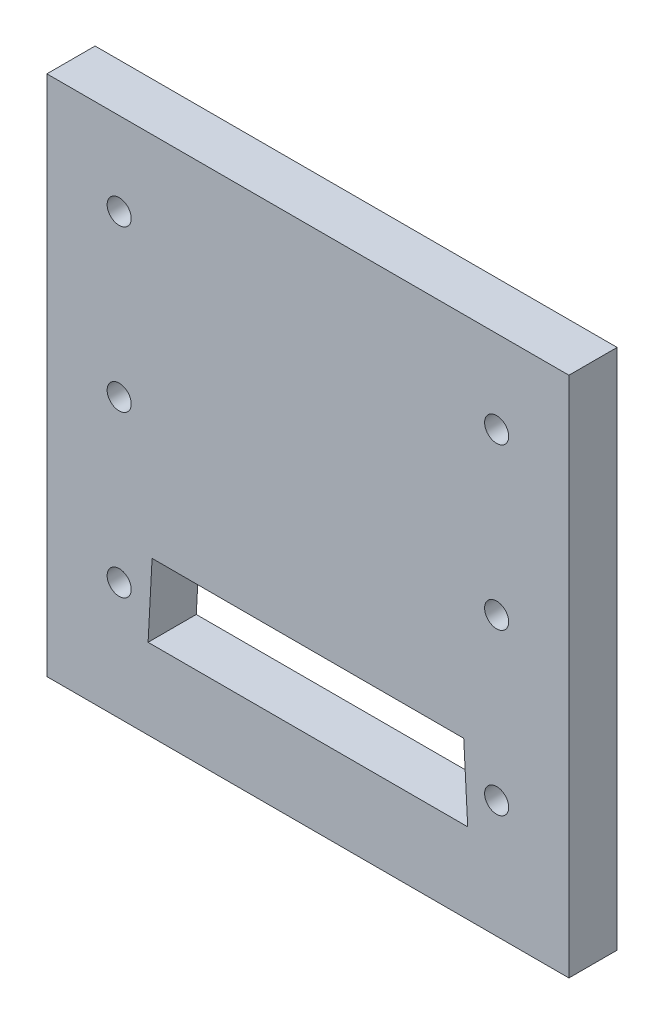
ISO-10303-21;
HEADER;
FILE_DESCRIPTION(('STEP AP214'),'2;1');
FILE_NAME('part.step','',(''),(''),'','','');
FILE_SCHEMA(('AUTOMOTIVE_DESIGN { 1 0 10303 214 1 1 1 1 }'));
ENDSEC;
DATA;
#1=APPLICATION_CONTEXT('core data for automotive mechanical design processes');
#2=APPLICATION_PROTOCOL_DEFINITION('international standard','automotive_design',2000,#1);
#3=PRODUCT_CONTEXT('',#1,'mechanical');
#4=PRODUCT('Part','Part','',(#3));
#5=PRODUCT_RELATED_PRODUCT_CATEGORY('part','',(#4));
#6=PRODUCT_DEFINITION_FORMATION('','',#4);
#7=PRODUCT_DEFINITION_CONTEXT('part definition',#1,'design');
#8=PRODUCT_DEFINITION('design','',#6,#7);
#9=PRODUCT_DEFINITION_SHAPE('','',#8);
#10=(LENGTH_UNIT() NAMED_UNIT(*) SI_UNIT(.MILLI.,.METRE.));
#11=(NAMED_UNIT(*) PLANE_ANGLE_UNIT() SI_UNIT($,.RADIAN.));
#12=(NAMED_UNIT(*) SI_UNIT($,.STERADIAN.) SOLID_ANGLE_UNIT());
#13=UNCERTAINTY_MEASURE_WITH_UNIT(LENGTH_MEASURE(1.E-05),#10,'distance_accuracy_value','');
#14=(GEOMETRIC_REPRESENTATION_CONTEXT(3) GLOBAL_UNCERTAINTY_ASSIGNED_CONTEXT((#13)) GLOBAL_UNIT_ASSIGNED_CONTEXT((#10,
#11,#12)) REPRESENTATION_CONTEXT('',''));
#15=CARTESIAN_POINT('',(0.,0.,0.));
#16=DIRECTION('',(0.,0.,1.));
#17=DIRECTION('',(1.,0.,0.));
#18=AXIS2_PLACEMENT_3D('',#15,#16,#17);
#19=CARTESIAN_POINT('',(0.,0.,6.));
#20=DIRECTION('',(0.,0.,1.));
#21=DIRECTION('',(1.,0.,0.));
#22=AXIS2_PLACEMENT_3D('',#19,#20,#21);
#23=PLANE('',#22);
#24=CARTESIAN_POINT('',(-3.60000000000014,44.65,6.));
#25=DIRECTION('',(0.,0.,1.));
#26=DIRECTION('',(1.,0.,0.));
#27=AXIS2_PLACEMENT_3D('',#24,#25,#26);
#28=CIRCLE('',#27,1.5);
#29=CARTESIAN_POINT('',(-2.10000000000014,44.65,6.));
#30=VERTEX_POINT('',#29);
#31=EDGE_CURVE('E253',#30,#30,#28,.T.);
#32=ORIENTED_EDGE('',*,*,#31,.F.);
#33=EDGE_LOOP('',(#32));
#34=FACE_BOUND('',#33,.T.);
#35=CARTESIAN_POINT('',(-3.60000000000007,24.65,6.));
#36=DIRECTION('',(0.,0.,1.));
#37=DIRECTION('',(1.,0.,0.));
#38=AXIS2_PLACEMENT_3D('',#35,#36,#37);
#39=CIRCLE('',#38,1.5);
#40=CARTESIAN_POINT('',(-2.10000000000007,24.65,6.));
#41=VERTEX_POINT('',#40);
#42=EDGE_CURVE('E265',#41,#41,#39,.T.);
#43=ORIENTED_EDGE('',*,*,#42,.F.);
#44=EDGE_LOOP('',(#43));
#45=FACE_BOUND('',#44,.T.);
#46=CARTESIAN_POINT('',(-3.6,4.65,6.));
#47=DIRECTION('',(0.,0.,1.));
#48=DIRECTION('',(1.,0.,0.));
#49=AXIS2_PLACEMENT_3D('',#46,#47,#48);
#50=CIRCLE('',#49,1.5);
#51=CARTESIAN_POINT('',(-2.1,4.65,6.));
#52=VERTEX_POINT('',#51);
#53=EDGE_CURVE('E127',#52,#52,#50,.T.);
#54=ORIENTED_EDGE('',*,*,#53,.F.);
#55=EDGE_LOOP('',(#54));
#56=FACE_BOUND('',#55,.T.);
#57=DIRECTION('',(0.,-1.,0.));
#58=VECTOR('',#57,1.);
#59=CARTESIAN_POINT('',(-12.6,55.,6.));
#60=LINE('',#59,#58);
#61=CARTESIAN_POINT('',(-12.6,55.,6.));
#62=VERTEX_POINT('',#61);
#63=CARTESIAN_POINT('',(-12.6,-10.,6.));
#64=VERTEX_POINT('',#63);
#65=EDGE_CURVE('E137',#62,#64,#60,.T.);
#66=ORIENTED_EDGE('',*,*,#65,.T.);
#67=DIRECTION('',(1.,0.,0.));
#68=VECTOR('',#67,1.);
#69=CARTESIAN_POINT('',(-12.6,-10.,6.));
#70=LINE('',#69,#68);
#71=CARTESIAN_POINT('',(52.4,-10.,6.));
#72=VERTEX_POINT('',#71);
#73=EDGE_CURVE('E140',#64,#72,#70,.T.);
#74=ORIENTED_EDGE('',*,*,#73,.T.);
#75=DIRECTION('',(0.,1.,0.));
#76=VECTOR('',#75,1.);
#77=CARTESIAN_POINT('',(52.4,55.,6.));
#78=LINE('',#77,#76);
#79=CARTESIAN_POINT('',(52.4,55.,6.));
#80=VERTEX_POINT('',#79);
#81=EDGE_CURVE('E143',#72,#80,#78,.T.);
#82=ORIENTED_EDGE('',*,*,#81,.T.);
#83=DIRECTION('',(-1.,0.,0.));
#84=VECTOR('',#83,1.);
#85=CARTESIAN_POINT('',(-12.6,55.,6.));
#86=LINE('',#85,#84);
#87=EDGE_CURVE('E145',#80,#62,#86,.T.);
#88=ORIENTED_EDGE('',*,*,#87,.T.);
#89=EDGE_LOOP('',(#66,#74,#82,#88));
#90=FACE_BOUND('',#89,.T.);
#91=DIRECTION('',(1.,0.,0.));
#92=VECTOR('',#91,1.);
#93=CARTESIAN_POINT('',(0.,0.,6.));
#94=LINE('',#93,#92);
#95=CARTESIAN_POINT('',(0.,0.,6.));
#96=VERTEX_POINT('',#95);
#97=CARTESIAN_POINT('',(39.8,0.,6.));
#98=VERTEX_POINT('',#97);
#99=EDGE_CURVE('E106',#96,#98,#94,.T.);
#100=ORIENTED_EDGE('',*,*,#99,.F.);
#101=DIRECTION('',(-0.053685907087273,-0.998557871823269,0.));
#102=VECTOR('',#101,1.);
#103=CARTESIAN_POINT('',(0.,0.,6.));
#104=LINE('',#103,#102);
#105=CARTESIAN_POINT('',(0.500000000000004,9.3,6.));
#106=VERTEX_POINT('',#105);
#107=EDGE_CURVE('E98',#106,#96,#104,.T.);
#108=ORIENTED_EDGE('',*,*,#107,.F.);
#109=DIRECTION('',(-1.,0.,0.));
#110=VECTOR('',#109,1.);
#111=CARTESIAN_POINT('',(0.500000000000004,9.3,6.));
#112=LINE('',#111,#110);
#113=CARTESIAN_POINT('',(39.3,9.30000000000001,6.));
#114=VERTEX_POINT('',#113);
#115=EDGE_CURVE('E121',#114,#106,#112,.T.);
#116=ORIENTED_EDGE('',*,*,#115,.F.);
#117=DIRECTION('',(-0.0536859070872725,0.998557871823269,0.));
#118=VECTOR('',#117,1.);
#119=CARTESIAN_POINT('',(39.8,0.,6.));
#120=LINE('',#119,#118);
#121=EDGE_CURVE('E119',#98,#114,#120,.T.);
#122=ORIENTED_EDGE('',*,*,#121,.F.);
#123=EDGE_LOOP('',(#100,#108,#116,#122));
#124=FACE_BOUND('',#123,.T.);
#125=CARTESIAN_POINT('',(43.4,4.65,6.));
#126=DIRECTION('',(0.,0.,1.));
#127=DIRECTION('',(1.,0.,0.));
#128=AXIS2_PLACEMENT_3D('',#125,#126,#127);
#129=CIRCLE('',#128,1.5);
#130=CARTESIAN_POINT('',(44.9,4.65,6.));
#131=VERTEX_POINT('',#130);
#132=EDGE_CURVE('E271',#131,#131,#129,.T.);
#133=ORIENTED_EDGE('',*,*,#132,.F.);
#134=EDGE_LOOP('',(#133));
#135=FACE_BOUND('',#134,.T.);
#136=CARTESIAN_POINT('',(43.3999999999999,24.65,6.));
#137=DIRECTION('',(0.,0.,1.));
#138=DIRECTION('',(1.,0.,0.));
#139=AXIS2_PLACEMENT_3D('',#136,#137,#138);
#140=CIRCLE('',#139,1.5);
#141=CARTESIAN_POINT('',(44.8999999999999,24.65,6.));
#142=VERTEX_POINT('',#141);
#143=EDGE_CURVE('E259',#142,#142,#140,.T.);
#144=ORIENTED_EDGE('',*,*,#143,.F.);
#145=EDGE_LOOP('',(#144));
#146=FACE_BOUND('',#145,.T.);
#147=CARTESIAN_POINT('',(43.3999999999999,44.65,6.));
#148=DIRECTION('',(0.,0.,1.));
#149=DIRECTION('',(1.,0.,0.));
#150=AXIS2_PLACEMENT_3D('',#147,#148,#149);
#151=CIRCLE('',#150,1.5);
#152=CARTESIAN_POINT('',(44.8999999999999,44.65,6.));
#153=VERTEX_POINT('',#152);
#154=EDGE_CURVE('E244',#153,#153,#151,.T.);
#155=ORIENTED_EDGE('',*,*,#154,.F.);
#156=EDGE_LOOP('',(#155));
#157=FACE_BOUND('',#156,.T.);
#158=ADVANCED_FACE('F33',(#34,#45,#56,#90,#124,#135,#146,#157),#23,.T.);
#159=CARTESIAN_POINT('',(0.,0.,0.));
#160=DIRECTION('',(0.,0.,1.));
#161=DIRECTION('',(1.,0.,0.));
#162=AXIS2_PLACEMENT_3D('',#159,#160,#161);
#163=PLANE('',#162);
#164=DIRECTION('',(0.,-1.,0.));
#165=VECTOR('',#164,1.);
#166=CARTESIAN_POINT('',(-12.6,55.,0.));
#167=LINE('',#166,#165);
#168=CARTESIAN_POINT('',(-12.6,55.,0.));
#169=VERTEX_POINT('',#168);
#170=CARTESIAN_POINT('',(-12.6,-10.,0.));
#171=VERTEX_POINT('',#170);
#172=EDGE_CURVE('E114',#169,#171,#167,.T.);
#173=ORIENTED_EDGE('',*,*,#172,.F.);
#174=DIRECTION('',(-1.,0.,0.));
#175=VECTOR('',#174,1.);
#176=CARTESIAN_POINT('',(-12.6,55.,0.));
#177=LINE('',#176,#175);
#178=CARTESIAN_POINT('',(52.4,55.,0.));
#179=VERTEX_POINT('',#178);
#180=EDGE_CURVE('E141',#179,#169,#177,.T.);
#181=ORIENTED_EDGE('',*,*,#180,.F.);
#182=DIRECTION('',(0.,1.,0.));
#183=VECTOR('',#182,1.);
#184=CARTESIAN_POINT('',(52.4,55.,0.));
#185=LINE('',#184,#183);
#186=CARTESIAN_POINT('',(52.4,-10.,0.));
#187=VERTEX_POINT('',#186);
#188=EDGE_CURVE('E152',#187,#179,#185,.T.);
#189=ORIENTED_EDGE('',*,*,#188,.F.);
#190=DIRECTION('',(1.,0.,0.));
#191=VECTOR('',#190,1.);
#192=CARTESIAN_POINT('',(-12.6,-10.,0.));
#193=LINE('',#192,#191);
#194=EDGE_CURVE('E150',#171,#187,#193,.T.);
#195=ORIENTED_EDGE('',*,*,#194,.F.);
#196=EDGE_LOOP('',(#173,#181,#189,#195));
#197=FACE_BOUND('',#196,.T.);
#198=DIRECTION('',(-0.053685907087273,-0.998557871823269,0.));
#199=VECTOR('',#198,1.);
#200=CARTESIAN_POINT('',(0.,0.,0.));
#201=LINE('',#200,#199);
#202=CARTESIAN_POINT('',(0.500000000000004,9.3,0.));
#203=VERTEX_POINT('',#202);
#204=CARTESIAN_POINT('',(0.,0.,0.));
#205=VERTEX_POINT('',#204);
#206=EDGE_CURVE('E56',#203,#205,#201,.T.);
#207=ORIENTED_EDGE('',*,*,#206,.T.);
#208=DIRECTION('',(1.,0.,0.));
#209=VECTOR('',#208,1.);
#210=CARTESIAN_POINT('',(0.,0.,0.));
#211=LINE('',#210,#209);
#212=CARTESIAN_POINT('',(39.8,0.,0.));
#213=VERTEX_POINT('',#212);
#214=EDGE_CURVE('E113',#205,#213,#211,.T.);
#215=ORIENTED_EDGE('',*,*,#214,.T.);
#216=DIRECTION('',(-0.0536859070872725,0.998557871823269,0.));
#217=VECTOR('',#216,1.);
#218=CARTESIAN_POINT('',(39.8,0.,0.));
#219=LINE('',#218,#217);
#220=CARTESIAN_POINT('',(39.3,9.30000000000001,0.));
#221=VERTEX_POINT('',#220);
#222=EDGE_CURVE('E129',#213,#221,#219,.T.);
#223=ORIENTED_EDGE('',*,*,#222,.T.);
#224=DIRECTION('',(-1.,0.,0.));
#225=VECTOR('',#224,1.);
#226=CARTESIAN_POINT('',(0.500000000000004,9.3,0.));
#227=LINE('',#226,#225);
#228=EDGE_CURVE('E107',#221,#203,#227,.T.);
#229=ORIENTED_EDGE('',*,*,#228,.T.);
#230=EDGE_LOOP('',(#207,#215,#223,#229));
#231=FACE_BOUND('',#230,.T.);
#232=CARTESIAN_POINT('',(-3.6,4.65,0.));
#233=DIRECTION('',(0.,0.,1.));
#234=DIRECTION('',(1.,0.,0.));
#235=AXIS2_PLACEMENT_3D('',#232,#233,#234);
#236=CIRCLE('',#235,1.5);
#237=CARTESIAN_POINT('',(-2.1,4.65,0.));
#238=VERTEX_POINT('',#237);
#239=EDGE_CURVE('E274',#238,#238,#236,.T.);
#240=ORIENTED_EDGE('',*,*,#239,.T.);
#241=EDGE_LOOP('',(#240));
#242=FACE_BOUND('',#241,.T.);
#243=CARTESIAN_POINT('',(43.4,4.65,0.));
#244=DIRECTION('',(0.,0.,1.));
#245=DIRECTION('',(1.,0.,0.));
#246=AXIS2_PLACEMENT_3D('',#243,#244,#245);
#247=CIRCLE('',#246,1.5);
#248=CARTESIAN_POINT('',(44.9,4.65,0.));
#249=VERTEX_POINT('',#248);
#250=EDGE_CURVE('E268',#249,#249,#247,.T.);
#251=ORIENTED_EDGE('',*,*,#250,.T.);
#252=EDGE_LOOP('',(#251));
#253=FACE_BOUND('',#252,.T.);
#254=CARTESIAN_POINT('',(-3.60000000000007,24.65,0.));
#255=DIRECTION('',(0.,0.,1.));
#256=DIRECTION('',(1.,0.,0.));
#257=AXIS2_PLACEMENT_3D('',#254,#255,#256);
#258=CIRCLE('',#257,1.5);
#259=CARTESIAN_POINT('',(-2.10000000000007,24.65,0.));
#260=VERTEX_POINT('',#259);
#261=EDGE_CURVE('E262',#260,#260,#258,.T.);
#262=ORIENTED_EDGE('',*,*,#261,.T.);
#263=EDGE_LOOP('',(#262));
#264=FACE_BOUND('',#263,.T.);
#265=CARTESIAN_POINT('',(43.3999999999999,24.65,0.));
#266=DIRECTION('',(0.,0.,1.));
#267=DIRECTION('',(1.,0.,0.));
#268=AXIS2_PLACEMENT_3D('',#265,#266,#267);
#269=CIRCLE('',#268,1.5);
#270=CARTESIAN_POINT('',(44.8999999999999,24.65,0.));
#271=VERTEX_POINT('',#270);
#272=EDGE_CURVE('E256',#271,#271,#269,.T.);
#273=ORIENTED_EDGE('',*,*,#272,.T.);
#274=EDGE_LOOP('',(#273));
#275=FACE_BOUND('',#274,.T.);
#276=CARTESIAN_POINT('',(-3.60000000000014,44.65,0.));
#277=DIRECTION('',(0.,0.,1.));
#278=DIRECTION('',(1.,0.,0.));
#279=AXIS2_PLACEMENT_3D('',#276,#277,#278);
#280=CIRCLE('',#279,1.5);
#281=CARTESIAN_POINT('',(-2.10000000000014,44.65,0.));
#282=VERTEX_POINT('',#281);
#283=EDGE_CURVE('E250',#282,#282,#280,.T.);
#284=ORIENTED_EDGE('',*,*,#283,.T.);
#285=EDGE_LOOP('',(#284));
#286=FACE_BOUND('',#285,.T.);
#287=CARTESIAN_POINT('',(43.3999999999999,44.65,0.));
#288=DIRECTION('',(0.,0.,1.));
#289=DIRECTION('',(1.,0.,0.));
#290=AXIS2_PLACEMENT_3D('',#287,#288,#289);
#291=CIRCLE('',#290,1.5);
#292=CARTESIAN_POINT('',(44.8999999999999,44.65,0.));
#293=VERTEX_POINT('',#292);
#294=EDGE_CURVE('E247',#293,#293,#291,.T.);
#295=ORIENTED_EDGE('',*,*,#294,.T.);
#296=EDGE_LOOP('',(#295));
#297=FACE_BOUND('',#296,.T.);
#298=ADVANCED_FACE('F170',(#197,#231,#242,#253,#264,#275,#286,#297),#163,.F.);
#299=CARTESIAN_POINT('',(-12.6,55.,6.));
#300=DIRECTION('',(1.,0.,0.));
#301=DIRECTION('',(0.,1.,0.));
#302=AXIS2_PLACEMENT_3D('',#299,#300,#301);
#303=PLANE('',#302);
#304=ORIENTED_EDGE('',*,*,#172,.T.);
#305=DIRECTION('',(0.,0.,-1.));
#306=VECTOR('',#305,1.);
#307=CARTESIAN_POINT('',(-12.6,-10.,6.));
#308=LINE('',#307,#306);
#309=EDGE_CURVE('E11',#64,#171,#308,.T.);
#310=ORIENTED_EDGE('',*,*,#309,.F.);
#311=ORIENTED_EDGE('',*,*,#65,.F.);
#312=DIRECTION('',(0.,0.,-1.));
#313=VECTOR('',#312,1.);
#314=CARTESIAN_POINT('',(-12.6,55.,6.));
#315=LINE('',#314,#313);
#316=EDGE_CURVE('E147',#62,#169,#315,.T.);
#317=ORIENTED_EDGE('',*,*,#316,.T.);
#318=EDGE_LOOP('',(#304,#310,#311,#317));
#319=FACE_BOUND('',#318,.T.);
#320=ADVANCED_FACE('F35',(#319),#303,.F.);
#321=CARTESIAN_POINT('',(-12.6,-10.,6.));
#322=DIRECTION('',(0.,1.,0.));
#323=DIRECTION('',(0.,0.,1.));
#324=AXIS2_PLACEMENT_3D('',#321,#322,#323);
#325=PLANE('',#324);
#326=ORIENTED_EDGE('',*,*,#194,.T.);
#327=DIRECTION('',(0.,0.,-1.));
#328=VECTOR('',#327,1.);
#329=CARTESIAN_POINT('',(52.4,-10.,6.));
#330=LINE('',#329,#328);
#331=EDGE_CURVE('E41',#72,#187,#330,.T.);
#332=ORIENTED_EDGE('',*,*,#331,.F.);
#333=ORIENTED_EDGE('',*,*,#73,.F.);
#334=ORIENTED_EDGE('',*,*,#309,.T.);
#335=EDGE_LOOP('',(#326,#332,#333,#334));
#336=FACE_BOUND('',#335,.T.);
#337=ADVANCED_FACE('F180',(#336),#325,.F.);
#338=CARTESIAN_POINT('',(52.4,55.,6.));
#339=DIRECTION('',(-1.,0.,0.));
#340=DIRECTION('',(0.,-1.,0.));
#341=AXIS2_PLACEMENT_3D('',#338,#339,#340);
#342=PLANE('',#341);
#343=ORIENTED_EDGE('',*,*,#188,.T.);
#344=DIRECTION('',(0.,0.,-1.));
#345=VECTOR('',#344,1.);
#346=CARTESIAN_POINT('',(52.4,55.,6.));
#347=LINE('',#346,#345);
#348=EDGE_CURVE('E157',#80,#179,#347,.T.);
#349=ORIENTED_EDGE('',*,*,#348,.F.);
#350=ORIENTED_EDGE('',*,*,#81,.F.);
#351=ORIENTED_EDGE('',*,*,#331,.T.);
#352=EDGE_LOOP('',(#343,#349,#350,#351));
#353=FACE_BOUND('',#352,.T.);
#354=ADVANCED_FACE('F164',(#353),#342,.F.);
#355=CARTESIAN_POINT('',(-12.6,55.,6.));
#356=DIRECTION('',(0.,-1.,0.));
#357=DIRECTION('',(0.,0.,-1.));
#358=AXIS2_PLACEMENT_3D('',#355,#356,#357);
#359=PLANE('',#358);
#360=ORIENTED_EDGE('',*,*,#180,.T.);
#361=ORIENTED_EDGE('',*,*,#316,.F.);
#362=ORIENTED_EDGE('',*,*,#87,.F.);
#363=ORIENTED_EDGE('',*,*,#348,.T.);
#364=EDGE_LOOP('',(#360,#361,#362,#363));
#365=FACE_BOUND('',#364,.T.);
#366=ADVANCED_FACE('F174',(#365),#359,.F.);
#367=CARTESIAN_POINT('',(0.,0.,6.));
#368=DIRECTION('',(0.998557871823269,-0.0536859070872729,0.));
#369=DIRECTION('',(0.053685907087273,0.998557871823269,0.));
#370=AXIS2_PLACEMENT_3D('',#367,#368,#369);
#371=PLANE('',#370);
#372=ORIENTED_EDGE('',*,*,#206,.F.);
#373=DIRECTION('',(0.,0.,-1.));
#374=VECTOR('',#373,1.);
#375=CARTESIAN_POINT('',(0.500000000000004,9.3,6.));
#376=LINE('',#375,#374);
#377=EDGE_CURVE('E102',#106,#203,#376,.T.);
#378=ORIENTED_EDGE('',*,*,#377,.F.);
#379=ORIENTED_EDGE('',*,*,#107,.T.);
#380=DIRECTION('',(0.,0.,-1.));
#381=VECTOR('',#380,1.);
#382=CARTESIAN_POINT('',(0.,0.,6.));
#383=LINE('',#382,#381);
#384=EDGE_CURVE('E101',#96,#205,#383,.T.);
#385=ORIENTED_EDGE('',*,*,#384,.T.);
#386=EDGE_LOOP('',(#372,#378,#379,#385));
#387=FACE_BOUND('',#386,.T.);
#388=ADVANCED_FACE('F100',(#387),#371,.T.);
#389=CARTESIAN_POINT('',(0.,0.,6.));
#390=DIRECTION('',(0.,1.,0.));
#391=DIRECTION('',(0.,0.,1.));
#392=AXIS2_PLACEMENT_3D('',#389,#390,#391);
#393=PLANE('',#392);
#394=ORIENTED_EDGE('',*,*,#214,.F.);
#395=ORIENTED_EDGE('',*,*,#384,.F.);
#396=ORIENTED_EDGE('',*,*,#99,.T.);
#397=DIRECTION('',(0.,0.,-1.));
#398=VECTOR('',#397,1.);
#399=CARTESIAN_POINT('',(39.8,0.,6.));
#400=LINE('',#399,#398);
#401=EDGE_CURVE('E115',#98,#213,#400,.T.);
#402=ORIENTED_EDGE('',*,*,#401,.T.);
#403=EDGE_LOOP('',(#394,#395,#396,#402));
#404=FACE_BOUND('',#403,.T.);
#405=ADVANCED_FACE('F110',(#404),#393,.T.);
#406=CARTESIAN_POINT('',(39.8,0.,6.));
#407=DIRECTION('',(-0.998557871823269,-0.0536859070872725,0.));
#408=DIRECTION('',(0.0536859070872725,-0.998557871823269,0.));
#409=AXIS2_PLACEMENT_3D('',#406,#407,#408);
#410=PLANE('',#409);
#411=ORIENTED_EDGE('',*,*,#222,.F.);
#412=ORIENTED_EDGE('',*,*,#401,.F.);
#413=ORIENTED_EDGE('',*,*,#121,.T.);
#414=DIRECTION('',(0.,0.,-1.));
#415=VECTOR('',#414,1.);
#416=CARTESIAN_POINT('',(39.3,9.30000000000001,6.));
#417=LINE('',#416,#415);
#418=EDGE_CURVE('E48',#114,#221,#417,.T.);
#419=ORIENTED_EDGE('',*,*,#418,.T.);
#420=EDGE_LOOP('',(#411,#412,#413,#419));
#421=FACE_BOUND('',#420,.T.);
#422=ADVANCED_FACE('F206',(#421),#410,.T.);
#423=CARTESIAN_POINT('',(0.500000000000004,9.3,6.));
#424=DIRECTION('',(0.,-1.,0.));
#425=DIRECTION('',(1.,0.,0.));
#426=AXIS2_PLACEMENT_3D('',#423,#424,#425);
#427=PLANE('',#426);
#428=ORIENTED_EDGE('',*,*,#228,.F.);
#429=ORIENTED_EDGE('',*,*,#418,.F.);
#430=ORIENTED_EDGE('',*,*,#115,.T.);
#431=ORIENTED_EDGE('',*,*,#377,.T.);
#432=EDGE_LOOP('',(#428,#429,#430,#431));
#433=FACE_BOUND('',#432,.T.);
#434=ADVANCED_FACE('F210',(#433),#427,.T.);
#435=CARTESIAN_POINT('',(-3.6,4.65,6.));
#436=DIRECTION('',(0.,0.,-1.));
#437=DIRECTION('',(-1.,0.,0.));
#438=AXIS2_PLACEMENT_3D('',#435,#436,#437);
#439=CYLINDRICAL_SURFACE('',#438,1.5);
#440=ORIENTED_EDGE('',*,*,#53,.T.);
#441=EDGE_LOOP('',(#440));
#442=FACE_BOUND('',#441,.T.);
#443=ORIENTED_EDGE('',*,*,#239,.F.);
#444=EDGE_LOOP('',(#443));
#445=FACE_BOUND('',#444,.T.);
#446=ADVANCED_FACE('F216',(#442,#445),#439,.F.);
#447=CARTESIAN_POINT('',(43.4,4.65,6.));
#448=DIRECTION('',(0.,0.,-1.));
#449=DIRECTION('',(-1.,0.,0.));
#450=AXIS2_PLACEMENT_3D('',#447,#448,#449);
#451=CYLINDRICAL_SURFACE('',#450,1.5);
#452=ORIENTED_EDGE('',*,*,#132,.T.);
#453=EDGE_LOOP('',(#452));
#454=FACE_BOUND('',#453,.T.);
#455=ORIENTED_EDGE('',*,*,#250,.F.);
#456=EDGE_LOOP('',(#455));
#457=FACE_BOUND('',#456,.T.);
#458=ADVANCED_FACE('F219',(#454,#457),#451,.F.);
#459=CARTESIAN_POINT('',(-3.60000000000007,24.65,6.));
#460=DIRECTION('',(0.,0.,-1.));
#461=DIRECTION('',(-1.,0.,0.));
#462=AXIS2_PLACEMENT_3D('',#459,#460,#461);
#463=CYLINDRICAL_SURFACE('',#462,1.5);
#464=ORIENTED_EDGE('',*,*,#42,.T.);
#465=EDGE_LOOP('',(#464));
#466=FACE_BOUND('',#465,.T.);
#467=ORIENTED_EDGE('',*,*,#261,.F.);
#468=EDGE_LOOP('',(#467));
#469=FACE_BOUND('',#468,.T.);
#470=ADVANCED_FACE('F223',(#466,#469),#463,.F.);
#471=CARTESIAN_POINT('',(43.3999999999999,24.65,6.));
#472=DIRECTION('',(0.,0.,-1.));
#473=DIRECTION('',(-1.,0.,0.));
#474=AXIS2_PLACEMENT_3D('',#471,#472,#473);
#475=CYLINDRICAL_SURFACE('',#474,1.5);
#476=ORIENTED_EDGE('',*,*,#143,.T.);
#477=EDGE_LOOP('',(#476));
#478=FACE_BOUND('',#477,.T.);
#479=ORIENTED_EDGE('',*,*,#272,.F.);
#480=EDGE_LOOP('',(#479));
#481=FACE_BOUND('',#480,.T.);
#482=ADVANCED_FACE('F227',(#478,#481),#475,.F.);
#483=CARTESIAN_POINT('',(-3.60000000000014,44.65,6.));
#484=DIRECTION('',(0.,0.,-1.));
#485=DIRECTION('',(-1.,0.,0.));
#486=AXIS2_PLACEMENT_3D('',#483,#484,#485);
#487=CYLINDRICAL_SURFACE('',#486,1.5);
#488=ORIENTED_EDGE('',*,*,#31,.T.);
#489=EDGE_LOOP('',(#488));
#490=FACE_BOUND('',#489,.T.);
#491=ORIENTED_EDGE('',*,*,#283,.F.);
#492=EDGE_LOOP('',(#491));
#493=FACE_BOUND('',#492,.T.);
#494=ADVANCED_FACE('F231',(#490,#493),#487,.F.);
#495=CARTESIAN_POINT('',(43.3999999999999,44.65,6.));
#496=DIRECTION('',(0.,0.,-1.));
#497=DIRECTION('',(-1.,0.,0.));
#498=AXIS2_PLACEMENT_3D('',#495,#496,#497);
#499=CYLINDRICAL_SURFACE('',#498,1.5);
#500=ORIENTED_EDGE('',*,*,#154,.T.);
#501=EDGE_LOOP('',(#500));
#502=FACE_BOUND('',#501,.T.);
#503=ORIENTED_EDGE('',*,*,#294,.F.);
#504=EDGE_LOOP('',(#503));
#505=FACE_BOUND('',#504,.T.);
#506=ADVANCED_FACE('F235',(#502,#505),#499,.F.);
#507=CLOSED_SHELL('',(#158,#298,#320,#337,#354,#366,#388,#405,#422,#434,#446,#458,#470,#482,
#494,#506));
#508=MANIFOLD_SOLID_BREP('B2',#507);
#509=ADVANCED_BREP_SHAPE_REPRESENTATION('',(#18,#508),#14);
#510=SHAPE_DEFINITION_REPRESENTATION(#9,#509);
ENDSEC;
END-ISO-10303-21;
